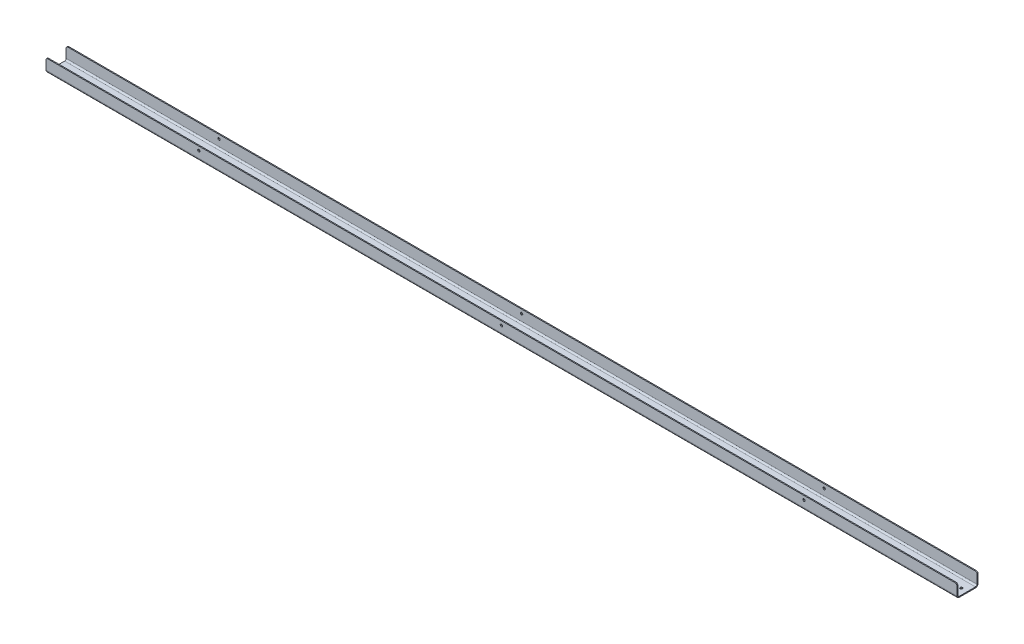
ISO-10303-21;
HEADER;
FILE_DESCRIPTION(('STEP AP214'),'2;1');
FILE_NAME('part.step','',(''),(''),'','','');
FILE_SCHEMA(('AUTOMOTIVE_DESIGN { 1 0 10303 214 1 1 1 1 }'));
ENDSEC;
DATA;
#1=APPLICATION_CONTEXT('core data for automotive mechanical design processes');
#2=APPLICATION_PROTOCOL_DEFINITION('international standard','automotive_design',2000,#1);
#3=PRODUCT_CONTEXT('',#1,'mechanical');
#4=PRODUCT('Part','Part','',(#3));
#5=PRODUCT_RELATED_PRODUCT_CATEGORY('part','',(#4));
#6=PRODUCT_DEFINITION_FORMATION('','',#4);
#7=PRODUCT_DEFINITION_CONTEXT('part definition',#1,'design');
#8=PRODUCT_DEFINITION('design','',#6,#7);
#9=PRODUCT_DEFINITION_SHAPE('','',#8);
#10=(LENGTH_UNIT() NAMED_UNIT(*) SI_UNIT(.MILLI.,.METRE.));
#11=(NAMED_UNIT(*) PLANE_ANGLE_UNIT() SI_UNIT($,.RADIAN.));
#12=(NAMED_UNIT(*) SI_UNIT($,.STERADIAN.) SOLID_ANGLE_UNIT());
#13=UNCERTAINTY_MEASURE_WITH_UNIT(LENGTH_MEASURE(1.E-05),#10,'distance_accuracy_value','');
#14=(GEOMETRIC_REPRESENTATION_CONTEXT(3) GLOBAL_UNCERTAINTY_ASSIGNED_CONTEXT((#13)) GLOBAL_UNIT_ASSIGNED_CONTEXT((#10,
#11,#12)) REPRESENTATION_CONTEXT('',''));
#15=CARTESIAN_POINT('',(0.,0.,0.));
#16=DIRECTION('',(0.,0.,1.));
#17=DIRECTION('',(1.,0.,0.));
#18=AXIS2_PLACEMENT_3D('',#15,#16,#17);
#19=CARTESIAN_POINT('',(1911.35,5.207,0.));
#20=DIRECTION('',(1.,0.,0.));
#21=DIRECTION('',(0.,0.,-1.));
#22=AXIS2_PLACEMENT_3D('',#19,#20,#21);
#23=PLANE('',#22);
#24=DIRECTION('',(0.,0.,-1.));
#25=VECTOR('',#24,1.);
#26=CARTESIAN_POINT('',(1911.35,5.207,0.));
#27=LINE('',#26,#25);
#28=CARTESIAN_POINT('',(1911.35,5.207,0.));
#29=VERTEX_POINT('',#28);
#30=CARTESIAN_POINT('',(1911.35,5.207,-2.032));
#31=VERTEX_POINT('',#30);
#32=EDGE_CURVE('E270',#29,#31,#27,.T.);
#33=ORIENTED_EDGE('',*,*,#32,.F.);
#34=CARTESIAN_POINT('',(1911.35,5.207,-5.207));
#35=DIRECTION('',(-1.,0.,0.));
#36=DIRECTION('',(0.,0.,1.));
#37=AXIS2_PLACEMENT_3D('',#34,#35,#36);
#38=CIRCLE('',#37,5.207);
#39=CARTESIAN_POINT('',(1911.35,0.,-5.207));
#40=VERTEX_POINT('',#39);
#41=EDGE_CURVE('E197',#29,#40,#38,.F.);
#42=ORIENTED_EDGE('',*,*,#41,.T.);
#43=DIRECTION('',(0.,-1.,0.));
#44=VECTOR('',#43,1.);
#45=CARTESIAN_POINT('',(1911.35,2.032,-5.207));
#46=LINE('',#45,#44);
#47=CARTESIAN_POINT('',(1911.35,2.032,-5.207));
#48=VERTEX_POINT('',#47);
#49=EDGE_CURVE('E268',#48,#40,#46,.T.);
#50=ORIENTED_EDGE('',*,*,#49,.F.);
#51=CARTESIAN_POINT('',(1911.35,5.207,-5.207));
#52=DIRECTION('',(1.,0.,0.));
#53=DIRECTION('',(0.,0.,-1.));
#54=AXIS2_PLACEMENT_3D('',#51,#52,#53);
#55=CIRCLE('',#54,3.175);
#56=EDGE_CURVE('E187',#31,#48,#55,.T.);
#57=ORIENTED_EDGE('',*,*,#56,.F.);
#58=EDGE_LOOP('',(#33,#42,#50,#57));
#59=FACE_BOUND('',#58,.T.);
#60=ADVANCED_FACE('F38',(#59),#23,.T.);
#61=CARTESIAN_POINT('',(1911.35,2.032,-5.207));
#62=DIRECTION('',(1.,0.,0.));
#63=DIRECTION('',(0.,0.,-1.));
#64=AXIS2_PLACEMENT_3D('',#61,#62,#63);
#65=PLANE('',#64);
#66=DIRECTION('',(0.,-1.,0.));
#67=VECTOR('',#66,1.);
#68=CARTESIAN_POINT('',(1911.35,27.432,-2.032));
#69=LINE('',#68,#67);
#70=CARTESIAN_POINT('',(1911.35,24.257,-2.032));
#71=VERTEX_POINT('',#70);
#72=EDGE_CURVE('E193',#71,#31,#69,.T.);
#73=ORIENTED_EDGE('',*,*,#72,.F.);
#74=DIRECTION('',(0.,0.,-1.));
#75=VECTOR('',#74,1.);
#76=CARTESIAN_POINT('',(1911.35,24.257,-5.207));
#77=LINE('',#76,#75);
#78=CARTESIAN_POINT('',(1911.35,24.257,0.));
#79=VERTEX_POINT('',#78);
#80=EDGE_CURVE('E282',#71,#79,#77,.F.);
#81=ORIENTED_EDGE('',*,*,#80,.T.);
#82=DIRECTION('',(0.,-1.,0.));
#83=VECTOR('',#82,1.);
#84=CARTESIAN_POINT('',(1911.35,27.432,0.));
#85=LINE('',#84,#83);
#86=EDGE_CURVE('E195',#79,#29,#85,.T.);
#87=ORIENTED_EDGE('',*,*,#86,.T.);
#88=ORIENTED_EDGE('',*,*,#32,.T.);
#89=EDGE_LOOP('',(#73,#81,#87,#88));
#90=FACE_BOUND('',#89,.T.);
#91=ADVANCED_FACE('F341',(#90),#65,.T.);
#92=CARTESIAN_POINT('',(0.,0.,-5.207));
#93=DIRECTION('',(-1.,0.,0.));
#94=DIRECTION('',(0.,0.,1.));
#95=AXIS2_PLACEMENT_3D('',#92,#93,#94);
#96=PLANE('',#95);
#97=DIRECTION('',(0.,1.,0.));
#98=VECTOR('',#97,1.);
#99=CARTESIAN_POINT('',(0.,0.,-5.207));
#100=LINE('',#99,#98);
#101=CARTESIAN_POINT('',(0.,0.,-5.207));
#102=VERTEX_POINT('',#101);
#103=CARTESIAN_POINT('',(0.,2.032,-5.207));
#104=VERTEX_POINT('',#103);
#105=EDGE_CURVE('E266',#102,#104,#100,.T.);
#106=ORIENTED_EDGE('',*,*,#105,.F.);
#107=CARTESIAN_POINT('',(0.,5.207,-5.207));
#108=DIRECTION('',(-1.,0.,0.));
#109=DIRECTION('',(0.,0.,1.));
#110=AXIS2_PLACEMENT_3D('',#107,#108,#109);
#111=CIRCLE('',#110,5.207);
#112=CARTESIAN_POINT('',(0.,5.207,0.));
#113=VERTEX_POINT('',#112);
#114=EDGE_CURVE('E222',#113,#102,#111,.F.);
#115=ORIENTED_EDGE('',*,*,#114,.F.);
#116=DIRECTION('',(0.,0.,1.));
#117=VECTOR('',#116,1.);
#118=CARTESIAN_POINT('',(0.,5.207,-2.032));
#119=LINE('',#118,#117);
#120=CARTESIAN_POINT('',(0.,5.207,-2.032));
#121=VERTEX_POINT('',#120);
#122=EDGE_CURVE('E263',#121,#113,#119,.T.);
#123=ORIENTED_EDGE('',*,*,#122,.F.);
#124=CARTESIAN_POINT('',(0.,5.207,-5.207));
#125=DIRECTION('',(1.,0.,0.));
#126=DIRECTION('',(0.,0.,-1.));
#127=AXIS2_PLACEMENT_3D('',#124,#125,#126);
#128=CIRCLE('',#127,3.175);
#129=EDGE_CURVE('E215',#121,#104,#128,.T.);
#130=ORIENTED_EDGE('',*,*,#129,.T.);
#131=EDGE_LOOP('',(#106,#115,#123,#130));
#132=FACE_BOUND('',#131,.T.);
#133=ADVANCED_FACE('F321',(#132),#96,.T.);
#134=CARTESIAN_POINT('',(0.,5.207,-2.032));
#135=DIRECTION('',(-1.,0.,0.));
#136=DIRECTION('',(0.,0.,1.));
#137=AXIS2_PLACEMENT_3D('',#134,#135,#136);
#138=PLANE('',#137);
#139=DIRECTION('',(0.,0.,-1.));
#140=VECTOR('',#139,1.);
#141=CARTESIAN_POINT('',(0.,0.,0.));
#142=LINE('',#141,#140);
#143=CARTESIAN_POINT('',(0.,0.,-39.243));
#144=VERTEX_POINT('',#143);
#145=EDGE_CURVE('E225',#102,#144,#142,.T.);
#146=ORIENTED_EDGE('',*,*,#145,.F.);
#147=ORIENTED_EDGE('',*,*,#105,.T.);
#148=DIRECTION('',(0.,0.,-1.));
#149=VECTOR('',#148,1.);
#150=CARTESIAN_POINT('',(0.,2.032,0.));
#151=LINE('',#150,#149);
#152=CARTESIAN_POINT('',(0.,2.032,-39.243));
#153=VERTEX_POINT('',#152);
#154=EDGE_CURVE('E212',#104,#153,#151,.T.);
#155=ORIENTED_EDGE('',*,*,#154,.T.);
#156=DIRECTION('',(0.,-1.,0.));
#157=VECTOR('',#156,1.);
#158=CARTESIAN_POINT('',(0.,2.032,-39.243));
#159=LINE('',#158,#157);
#160=EDGE_CURVE('E259',#153,#144,#159,.T.);
#161=ORIENTED_EDGE('',*,*,#160,.T.);
#162=EDGE_LOOP('',(#146,#147,#155,#161));
#163=FACE_BOUND('',#162,.T.);
#164=ADVANCED_FACE('F368',(#163),#138,.T.);
#165=CARTESIAN_POINT('',(1911.35,0.,-39.243));
#166=DIRECTION('',(1.,0.,0.));
#167=DIRECTION('',(0.,0.,-1.));
#168=AXIS2_PLACEMENT_3D('',#165,#166,#167);
#169=PLANE('',#168);
#170=DIRECTION('',(0.,1.,0.));
#171=VECTOR('',#170,1.);
#172=CARTESIAN_POINT('',(1911.35,0.,-39.243));
#173=LINE('',#172,#171);
#174=CARTESIAN_POINT('',(1911.35,0.,-39.243));
#175=VERTEX_POINT('',#174);
#176=CARTESIAN_POINT('',(1911.35,2.032,-39.243));
#177=VERTEX_POINT('',#176);
#178=EDGE_CURVE('E164',#175,#177,#173,.T.);
#179=ORIENTED_EDGE('',*,*,#178,.F.);
#180=CARTESIAN_POINT('',(1911.35,5.207,-39.243));
#181=DIRECTION('',(-1.,0.,0.));
#182=DIRECTION('',(0.,0.,1.));
#183=AXIS2_PLACEMENT_3D('',#180,#181,#182);
#184=CIRCLE('',#183,5.207);
#185=CARTESIAN_POINT('',(1911.35,5.207,-44.45));
#186=VERTEX_POINT('',#185);
#187=EDGE_CURVE('E162',#175,#186,#184,.F.);
#188=ORIENTED_EDGE('',*,*,#187,.T.);
#189=DIRECTION('',(0.,0.,-1.));
#190=VECTOR('',#189,1.);
#191=CARTESIAN_POINT('',(1911.35,5.207,-42.418));
#192=LINE('',#191,#190);
#193=CARTESIAN_POINT('',(1911.35,5.207,-42.418));
#194=VERTEX_POINT('',#193);
#195=EDGE_CURVE('E155',#194,#186,#192,.T.);
#196=ORIENTED_EDGE('',*,*,#195,.F.);
#197=CARTESIAN_POINT('',(1911.35,5.207,-39.243));
#198=DIRECTION('',(1.,0.,0.));
#199=DIRECTION('',(0.,0.,-1.));
#200=AXIS2_PLACEMENT_3D('',#197,#198,#199);
#201=CIRCLE('',#200,3.175);
#202=EDGE_CURVE('E159',#177,#194,#201,.T.);
#203=ORIENTED_EDGE('',*,*,#202,.F.);
#204=EDGE_LOOP('',(#179,#188,#196,#203));
#205=FACE_BOUND('',#204,.T.);
#206=ADVANCED_FACE('F157',(#205),#169,.T.);
#207=CARTESIAN_POINT('',(1911.35,5.207,-42.418));
#208=DIRECTION('',(1.,0.,0.));
#209=DIRECTION('',(0.,0.,-1.));
#210=AXIS2_PLACEMENT_3D('',#207,#208,#209);
#211=PLANE('',#210);
#212=DIRECTION('',(0.,0.,-1.));
#213=VECTOR('',#212,1.);
#214=CARTESIAN_POINT('',(1911.35,0.,0.));
#215=LINE('',#214,#213);
#216=EDGE_CURVE('E200',#40,#175,#215,.T.);
#217=ORIENTED_EDGE('',*,*,#216,.T.);
#218=ORIENTED_EDGE('',*,*,#178,.T.);
#219=DIRECTION('',(0.,0.,-1.));
#220=VECTOR('',#219,1.);
#221=CARTESIAN_POINT('',(1911.35,2.032,0.));
#222=LINE('',#221,#220);
#223=EDGE_CURVE('E185',#48,#177,#222,.T.);
#224=ORIENTED_EDGE('',*,*,#223,.F.);
#225=ORIENTED_EDGE('',*,*,#49,.T.);
#226=EDGE_LOOP('',(#217,#218,#224,#225));
#227=FACE_BOUND('',#226,.T.);
#228=ADVANCED_FACE('F374',(#227),#211,.T.);
#229=CARTESIAN_POINT('',(0.,5.207,-44.45));
#230=DIRECTION('',(-1.,0.,0.));
#231=DIRECTION('',(0.,0.,1.));
#232=AXIS2_PLACEMENT_3D('',#229,#230,#231);
#233=PLANE('',#232);
#234=DIRECTION('',(0.,0.,1.));
#235=VECTOR('',#234,1.);
#236=CARTESIAN_POINT('',(0.,5.207,-44.45));
#237=LINE('',#236,#235);
#238=CARTESIAN_POINT('',(0.,5.207,-44.45));
#239=VERTEX_POINT('',#238);
#240=CARTESIAN_POINT('',(0.,5.207,-42.418));
#241=VERTEX_POINT('',#240);
#242=EDGE_CURVE('E165',#239,#241,#237,.T.);
#243=ORIENTED_EDGE('',*,*,#242,.F.);
#244=CARTESIAN_POINT('',(0.,5.207,-39.243));
#245=DIRECTION('',(-1.,0.,0.));
#246=DIRECTION('',(0.,0.,1.));
#247=AXIS2_PLACEMENT_3D('',#244,#245,#246);
#248=CIRCLE('',#247,5.207);
#249=EDGE_CURVE('E228',#144,#239,#248,.F.);
#250=ORIENTED_EDGE('',*,*,#249,.F.);
#251=ORIENTED_EDGE('',*,*,#160,.F.);
#252=CARTESIAN_POINT('',(0.,5.207,-39.243));
#253=DIRECTION('',(1.,0.,0.));
#254=DIRECTION('',(0.,0.,-1.));
#255=AXIS2_PLACEMENT_3D('',#252,#253,#254);
#256=CIRCLE('',#255,3.175);
#257=EDGE_CURVE('E210',#153,#241,#256,.T.);
#258=ORIENTED_EDGE('',*,*,#257,.T.);
#259=EDGE_LOOP('',(#243,#250,#251,#258));
#260=FACE_BOUND('',#259,.T.);
#261=ADVANCED_FACE('F377',(#260),#233,.T.);
#262=CARTESIAN_POINT('',(0.,2.032,-39.243));
#263=DIRECTION('',(-1.,0.,0.));
#264=DIRECTION('',(0.,0.,1.));
#265=AXIS2_PLACEMENT_3D('',#262,#263,#264);
#266=PLANE('',#265);
#267=DIRECTION('',(0.,1.,0.));
#268=VECTOR('',#267,1.);
#269=CARTESIAN_POINT('',(0.,0.,-42.418));
#270=LINE('',#269,#268);
#271=CARTESIAN_POINT('',(0.,24.257,-42.418));
#272=VERTEX_POINT('',#271);
#273=EDGE_CURVE('E172',#241,#272,#270,.T.);
#274=ORIENTED_EDGE('',*,*,#273,.T.);
#275=DIRECTION('',(0.,0.,-1.));
#276=VECTOR('',#275,1.);
#277=CARTESIAN_POINT('',(0.,24.257,-39.243));
#278=LINE('',#277,#276);
#279=CARTESIAN_POINT('',(0.,24.257,-44.45));
#280=VERTEX_POINT('',#279);
#281=EDGE_CURVE('E11',#272,#280,#278,.T.);
#282=ORIENTED_EDGE('',*,*,#281,.T.);
#283=DIRECTION('',(0.,1.,0.));
#284=VECTOR('',#283,1.);
#285=CARTESIAN_POINT('',(0.,0.,-44.45));
#286=LINE('',#285,#284);
#287=EDGE_CURVE('E205',#239,#280,#286,.T.);
#288=ORIENTED_EDGE('',*,*,#287,.F.);
#289=ORIENTED_EDGE('',*,*,#242,.T.);
#290=EDGE_LOOP('',(#274,#282,#288,#289));
#291=FACE_BOUND('',#290,.T.);
#292=ADVANCED_FACE('F381',(#291),#266,.T.);
#293=CARTESIAN_POINT('',(1911.35,0.,-44.45));
#294=DIRECTION('',(0.,0.,1.));
#295=DIRECTION('',(1.,0.,0.));
#296=AXIS2_PLACEMENT_3D('',#293,#294,#295);
#297=PLANE('',#296);
#298=CARTESIAN_POINT('',(1590.675,19.05,-44.45));
#299=DIRECTION('',(0.,0.,-1.));
#300=DIRECTION('',(-1.,0.,0.));
#301=AXIS2_PLACEMENT_3D('',#298,#299,#300);
#302=CIRCLE('',#301,2.45110000000003);
#303=CARTESIAN_POINT('',(1588.2239,19.05,-44.45));
#304=VERTEX_POINT('',#303);
#305=EDGE_CURVE('E481',#304,#304,#302,.T.);
#306=ORIENTED_EDGE('',*,*,#305,.F.);
#307=EDGE_LOOP('',(#306));
#308=FACE_BOUND('',#307,.T.);
#309=CARTESIAN_POINT('',(955.675,19.05,-44.45));
#310=DIRECTION('',(0.,0.,-1.));
#311=DIRECTION('',(-1.,0.,0.));
#312=AXIS2_PLACEMENT_3D('',#309,#310,#311);
#313=CIRCLE('',#312,2.45110000000003);
#314=CARTESIAN_POINT('',(953.2239,19.05,-44.45));
#315=VERTEX_POINT('',#314);
#316=EDGE_CURVE('E492',#315,#315,#313,.T.);
#317=ORIENTED_EDGE('',*,*,#316,.F.);
#318=EDGE_LOOP('',(#317));
#319=FACE_BOUND('',#318,.T.);
#320=CARTESIAN_POINT('',(320.675,19.05,-44.45));
#321=DIRECTION('',(0.,0.,-1.));
#322=DIRECTION('',(-1.,0.,0.));
#323=AXIS2_PLACEMENT_3D('',#320,#321,#322);
#324=CIRCLE('',#323,2.45109999999997);
#325=CARTESIAN_POINT('',(318.2239,19.05,-44.45));
#326=VERTEX_POINT('',#325);
#327=EDGE_CURVE('E498',#326,#326,#324,.T.);
#328=ORIENTED_EDGE('',*,*,#327,.F.);
#329=EDGE_LOOP('',(#328));
#330=FACE_BOUND('',#329,.T.);
#331=DIRECTION('',(-1.,0.,0.));
#332=VECTOR('',#331,1.);
#333=CARTESIAN_POINT('',(1911.35,27.432,-44.45));
#334=LINE('',#333,#332);
#335=CARTESIAN_POINT('',(1908.175,27.432,-44.45));
#336=VERTEX_POINT('',#335);
#337=CARTESIAN_POINT('',(3.17499999999993,27.432,-44.45));
#338=VERTEX_POINT('',#337);
#339=EDGE_CURVE('E256',#336,#338,#334,.T.);
#340=ORIENTED_EDGE('',*,*,#339,.F.);
#341=CARTESIAN_POINT('',(1908.175,24.257,-44.45));
#342=DIRECTION('',(0.,0.,1.));
#343=DIRECTION('',(1.,0.,0.));
#344=AXIS2_PLACEMENT_3D('',#341,#342,#343);
#345=CIRCLE('',#344,3.175);
#346=CARTESIAN_POINT('',(1911.35,24.257,-44.45));
#347=VERTEX_POINT('',#346);
#348=EDGE_CURVE('E295',#336,#347,#345,.F.);
#349=ORIENTED_EDGE('',*,*,#348,.T.);
#350=DIRECTION('',(0.,1.,0.));
#351=VECTOR('',#350,1.);
#352=CARTESIAN_POINT('',(1911.35,0.,-44.45));
#353=LINE('',#352,#351);
#354=EDGE_CURVE('E180',#186,#347,#353,.T.);
#355=ORIENTED_EDGE('',*,*,#354,.F.);
#356=DIRECTION('',(-1.,0.,0.));
#357=VECTOR('',#356,1.);
#358=CARTESIAN_POINT('',(1911.35,5.207,-44.45));
#359=LINE('',#358,#357);
#360=EDGE_CURVE('E204',#186,#239,#359,.T.);
#361=ORIENTED_EDGE('',*,*,#360,.T.);
#362=ORIENTED_EDGE('',*,*,#287,.T.);
#363=CARTESIAN_POINT('',(3.175,24.257,-44.45));
#364=DIRECTION('',(0.,0.,1.));
#365=DIRECTION('',(1.,0.,0.));
#366=AXIS2_PLACEMENT_3D('',#363,#364,#365);
#367=CIRCLE('',#366,3.175);
#368=EDGE_CURVE('E293',#280,#338,#367,.F.);
#369=ORIENTED_EDGE('',*,*,#368,.T.);
#370=EDGE_LOOP('',(#340,#349,#355,#361,#362,#369));
#371=FACE_BOUND('',#370,.T.);
#372=ADVANCED_FACE('F385',(#308,#319,#330,#371),#297,.F.);
#373=CARTESIAN_POINT('',(1911.35,27.432,-42.418));
#374=DIRECTION('',(0.,1.,0.));
#375=DIRECTION('',(0.,0.,1.));
#376=AXIS2_PLACEMENT_3D('',#373,#374,#375);
#377=PLANE('',#376);
#378=DIRECTION('',(-1.,0.,0.));
#379=VECTOR('',#378,1.);
#380=CARTESIAN_POINT('',(1911.35,27.432,-42.418));
#381=LINE('',#380,#379);
#382=CARTESIAN_POINT('',(1908.175,27.432,-42.418));
#383=VERTEX_POINT('',#382);
#384=CARTESIAN_POINT('',(3.17499999999993,27.432,-42.418));
#385=VERTEX_POINT('',#384);
#386=EDGE_CURVE('E176',#383,#385,#381,.T.);
#387=ORIENTED_EDGE('',*,*,#386,.F.);
#388=DIRECTION('',(0.,0.,-1.));
#389=VECTOR('',#388,1.);
#390=CARTESIAN_POINT('',(1908.175,27.432,-42.418));
#391=LINE('',#390,#389);
#392=EDGE_CURVE('E290',#383,#336,#391,.T.);
#393=ORIENTED_EDGE('',*,*,#392,.T.);
#394=ORIENTED_EDGE('',*,*,#339,.T.);
#395=DIRECTION('',(0.,0.,-1.));
#396=VECTOR('',#395,1.);
#397=CARTESIAN_POINT('',(3.17499999999993,27.432,-42.418));
#398=LINE('',#397,#396);
#399=EDGE_CURVE('E288',#338,#385,#398,.F.);
#400=ORIENTED_EDGE('',*,*,#399,.T.);
#401=EDGE_LOOP('',(#387,#393,#394,#400));
#402=FACE_BOUND('',#401,.T.);
#403=ADVANCED_FACE('F389',(#402),#377,.T.);
#404=CARTESIAN_POINT('',(1911.35,0.,-42.418));
#405=DIRECTION('',(0.,0.,1.));
#406=DIRECTION('',(1.,0.,0.));
#407=AXIS2_PLACEMENT_3D('',#404,#405,#406);
#408=PLANE('',#407);
#409=CARTESIAN_POINT('',(1590.675,19.05,-42.418));
#410=DIRECTION('',(0.,0.,1.));
#411=DIRECTION('',(1.,0.,0.));
#412=AXIS2_PLACEMENT_3D('',#409,#410,#411);
#413=CIRCLE('',#412,2.45110000000003);
#414=CARTESIAN_POINT('',(1593.1261,19.05,-42.418));
#415=VERTEX_POINT('',#414);
#416=EDGE_CURVE('E510',#415,#415,#413,.T.);
#417=ORIENTED_EDGE('',*,*,#416,.F.);
#418=EDGE_LOOP('',(#417));
#419=FACE_BOUND('',#418,.T.);
#420=CARTESIAN_POINT('',(955.675,19.05,-42.418));
#421=DIRECTION('',(0.,0.,1.));
#422=DIRECTION('',(1.,0.,0.));
#423=AXIS2_PLACEMENT_3D('',#420,#421,#422);
#424=CIRCLE('',#423,2.45110000000003);
#425=CARTESIAN_POINT('',(958.1261,19.05,-42.418));
#426=VERTEX_POINT('',#425);
#427=EDGE_CURVE('E506',#426,#426,#424,.T.);
#428=ORIENTED_EDGE('',*,*,#427,.F.);
#429=EDGE_LOOP('',(#428));
#430=FACE_BOUND('',#429,.T.);
#431=CARTESIAN_POINT('',(320.675,19.05,-42.418));
#432=DIRECTION('',(0.,0.,1.));
#433=DIRECTION('',(1.,0.,0.));
#434=AXIS2_PLACEMENT_3D('',#431,#432,#433);
#435=CIRCLE('',#434,2.45109999999997);
#436=CARTESIAN_POINT('',(323.1261,19.05,-42.418));
#437=VERTEX_POINT('',#436);
#438=EDGE_CURVE('E484',#437,#437,#435,.T.);
#439=ORIENTED_EDGE('',*,*,#438,.F.);
#440=EDGE_LOOP('',(#439));
#441=FACE_BOUND('',#440,.T.);
#442=DIRECTION('',(0.,1.,0.));
#443=VECTOR('',#442,1.);
#444=CARTESIAN_POINT('',(1911.35,0.,-42.418));
#445=LINE('',#444,#443);
#446=CARTESIAN_POINT('',(1911.35,24.257,-42.418));
#447=VERTEX_POINT('',#446);
#448=EDGE_CURVE('E170',#194,#447,#445,.T.);
#449=ORIENTED_EDGE('',*,*,#448,.T.);
#450=CARTESIAN_POINT('',(1908.175,24.257,-42.418));
#451=DIRECTION('',(0.,0.,1.));
#452=DIRECTION('',(1.,0.,0.));
#453=AXIS2_PLACEMENT_3D('',#450,#451,#452);
#454=CIRCLE('',#453,3.175);
#455=EDGE_CURVE('E299',#447,#383,#454,.T.);
#456=ORIENTED_EDGE('',*,*,#455,.T.);
#457=ORIENTED_EDGE('',*,*,#386,.T.);
#458=CARTESIAN_POINT('',(3.175,24.257,-42.418));
#459=DIRECTION('',(0.,0.,1.));
#460=DIRECTION('',(1.,0.,0.));
#461=AXIS2_PLACEMENT_3D('',#458,#459,#460);
#462=CIRCLE('',#461,3.175);
#463=EDGE_CURVE('E53',#385,#272,#462,.T.);
#464=ORIENTED_EDGE('',*,*,#463,.T.);
#465=ORIENTED_EDGE('',*,*,#273,.F.);
#466=DIRECTION('',(-1.,0.,0.));
#467=VECTOR('',#466,1.);
#468=CARTESIAN_POINT('',(1911.35,5.207,-42.418));
#469=LINE('',#468,#467);
#470=EDGE_CURVE('E168',#194,#241,#469,.T.);
#471=ORIENTED_EDGE('',*,*,#470,.F.);
#472=EDGE_LOOP('',(#449,#456,#457,#464,#465,#471));
#473=FACE_BOUND('',#472,.T.);
#474=ADVANCED_FACE('F169',(#419,#430,#441,#473),#408,.T.);
#475=CARTESIAN_POINT('',(1911.35,5.207,-39.243));
#476=DIRECTION('',(-1.,0.,0.));
#477=DIRECTION('',(0.,0.,1.));
#478=AXIS2_PLACEMENT_3D('',#475,#476,#477);
#479=CYLINDRICAL_SURFACE('',#478,3.175);
#480=ORIENTED_EDGE('',*,*,#257,.F.);
#481=DIRECTION('',(-1.,0.,0.));
#482=VECTOR('',#481,1.);
#483=CARTESIAN_POINT('',(1911.35,2.032,-39.243));
#484=LINE('',#483,#482);
#485=EDGE_CURVE('E177',#177,#153,#484,.T.);
#486=ORIENTED_EDGE('',*,*,#485,.F.);
#487=ORIENTED_EDGE('',*,*,#202,.T.);
#488=ORIENTED_EDGE('',*,*,#470,.T.);
#489=EDGE_LOOP('',(#480,#486,#487,#488));
#490=FACE_BOUND('',#489,.T.);
#491=ADVANCED_FACE('F183',(#490),#479,.F.);
#492=CARTESIAN_POINT('',(1911.35,2.032,0.));
#493=DIRECTION('',(0.,1.,0.));
#494=DIRECTION('',(0.,0.,1.));
#495=AXIS2_PLACEMENT_3D('',#492,#493,#494);
#496=PLANE('',#495);
#497=CARTESIAN_POINT('',(12.7,2.032,-22.225));
#498=DIRECTION('',(0.,1.,0.));
#499=DIRECTION('',(0.,0.,1.));
#500=AXIS2_PLACEMENT_3D('',#497,#498,#499);
#501=CIRCLE('',#500,2.4511);
#502=CARTESIAN_POINT('',(12.7,2.032,-19.7739));
#503=VERTEX_POINT('',#502);
#504=EDGE_CURVE('E208',#503,#503,#501,.T.);
#505=ORIENTED_EDGE('',*,*,#504,.F.);
#506=EDGE_LOOP('',(#505));
#507=FACE_BOUND('',#506,.T.);
#508=CARTESIAN_POINT('',(1241.425,2.032,-22.225));
#509=DIRECTION('',(0.,1.,0.));
#510=DIRECTION('',(0.,0.,1.));
#511=AXIS2_PLACEMENT_3D('',#508,#509,#510);
#512=CIRCLE('',#511,2.45110000000003);
#513=CARTESIAN_POINT('',(1241.425,2.032,-19.7739));
#514=VERTEX_POINT('',#513);
#515=EDGE_CURVE('E555',#514,#514,#512,.T.);
#516=ORIENTED_EDGE('',*,*,#515,.F.);
#517=EDGE_LOOP('',(#516));
#518=FACE_BOUND('',#517,.T.);
#519=CARTESIAN_POINT('',(1260.475,2.032,-22.225));
#520=DIRECTION('',(0.,1.,0.));
#521=DIRECTION('',(0.,0.,1.));
#522=AXIS2_PLACEMENT_3D('',#519,#520,#521);
#523=CIRCLE('',#522,2.45110000000003);
#524=CARTESIAN_POINT('',(1260.475,2.032,-19.7739));
#525=VERTEX_POINT('',#524);
#526=EDGE_CURVE('E552',#525,#525,#523,.T.);
#527=ORIENTED_EDGE('',*,*,#526,.F.);
#528=EDGE_LOOP('',(#527));
#529=FACE_BOUND('',#528,.T.);
#530=CARTESIAN_POINT('',(1879.6,2.032,-22.225));
#531=DIRECTION('',(0.,1.,0.));
#532=DIRECTION('',(0.,0.,1.));
#533=AXIS2_PLACEMENT_3D('',#530,#531,#532);
#534=CIRCLE('',#533,2.45110000000003);
#535=CARTESIAN_POINT('',(1879.6,2.032,-19.7739));
#536=VERTEX_POINT('',#535);
#537=EDGE_CURVE('E549',#536,#536,#534,.T.);
#538=ORIENTED_EDGE('',*,*,#537,.F.);
#539=EDGE_LOOP('',(#538));
#540=FACE_BOUND('',#539,.T.);
#541=CARTESIAN_POINT('',(1898.65,2.032,-22.225));
#542=DIRECTION('',(0.,1.,0.));
#543=DIRECTION('',(0.,0.,1.));
#544=AXIS2_PLACEMENT_3D('',#541,#542,#543);
#545=CIRCLE('',#544,2.45110000000003);
#546=CARTESIAN_POINT('',(1898.65,2.032,-19.7739));
#547=VERTEX_POINT('',#546);
#548=EDGE_CURVE('E546',#547,#547,#545,.T.);
#549=ORIENTED_EDGE('',*,*,#548,.F.);
#550=EDGE_LOOP('',(#549));
#551=FACE_BOUND('',#550,.T.);
#552=CARTESIAN_POINT('',(669.925,2.032,-22.225));
#553=DIRECTION('',(0.,1.,0.));
#554=DIRECTION('',(0.,0.,1.));
#555=AXIS2_PLACEMENT_3D('',#552,#553,#554);
#556=CIRCLE('',#555,2.45110000000003);
#557=CARTESIAN_POINT('',(669.925,2.032,-19.7739));
#558=VERTEX_POINT('',#557);
#559=EDGE_CURVE('E543',#558,#558,#556,.T.);
#560=ORIENTED_EDGE('',*,*,#559,.F.);
#561=EDGE_LOOP('',(#560));
#562=FACE_BOUND('',#561,.T.);
#563=CARTESIAN_POINT('',(650.875,2.032,-22.225));
#564=DIRECTION('',(0.,1.,0.));
#565=DIRECTION('',(0.,0.,1.));
#566=AXIS2_PLACEMENT_3D('',#563,#564,#565);
#567=CIRCLE('',#566,2.45110000000003);
#568=CARTESIAN_POINT('',(650.875,2.032,-19.7739));
#569=VERTEX_POINT('',#568);
#570=EDGE_CURVE('E540',#569,#569,#567,.T.);
#571=ORIENTED_EDGE('',*,*,#570,.F.);
#572=EDGE_LOOP('',(#571));
#573=FACE_BOUND('',#572,.T.);
#574=CARTESIAN_POINT('',(31.75,2.032,-22.225));
#575=DIRECTION('',(0.,1.,0.));
#576=DIRECTION('',(0.,0.,1.));
#577=AXIS2_PLACEMENT_3D('',#574,#575,#576);
#578=CIRCLE('',#577,2.4511);
#579=CARTESIAN_POINT('',(31.75,2.032,-19.7739));
#580=VERTEX_POINT('',#579);
#581=EDGE_CURVE('E517',#580,#580,#578,.T.);
#582=ORIENTED_EDGE('',*,*,#581,.F.);
#583=EDGE_LOOP('',(#582));
#584=FACE_BOUND('',#583,.T.);
#585=ORIENTED_EDGE('',*,*,#154,.F.);
#586=DIRECTION('',(-1.,0.,0.));
#587=VECTOR('',#586,1.);
#588=CARTESIAN_POINT('',(1911.35,2.032,-5.207));
#589=LINE('',#588,#587);
#590=EDGE_CURVE('E251',#48,#104,#589,.T.);
#591=ORIENTED_EDGE('',*,*,#590,.F.);
#592=ORIENTED_EDGE('',*,*,#223,.T.);
#593=ORIENTED_EDGE('',*,*,#485,.T.);
#594=EDGE_LOOP('',(#585,#591,#592,#593));
#595=FACE_BOUND('',#594,.T.);
#596=ADVANCED_FACE('F399',(#507,#518,#529,#540,#551,#562,#573,#584,#595),#496,.T.);
#597=CARTESIAN_POINT('',(1911.35,5.207,-5.207));
#598=DIRECTION('',(-1.,0.,0.));
#599=DIRECTION('',(0.,0.,1.));
#600=AXIS2_PLACEMENT_3D('',#597,#598,#599);
#601=CYLINDRICAL_SURFACE('',#600,3.175);
#602=ORIENTED_EDGE('',*,*,#129,.F.);
#603=DIRECTION('',(-1.,0.,0.));
#604=VECTOR('',#603,1.);
#605=CARTESIAN_POINT('',(1911.35,5.207,-2.032));
#606=LINE('',#605,#604);
#607=EDGE_CURVE('E248',#31,#121,#606,.T.);
#608=ORIENTED_EDGE('',*,*,#607,.F.);
#609=ORIENTED_EDGE('',*,*,#56,.T.);
#610=ORIENTED_EDGE('',*,*,#590,.T.);
#611=EDGE_LOOP('',(#602,#608,#609,#610));
#612=FACE_BOUND('',#611,.T.);
#613=ADVANCED_FACE('F317',(#612),#601,.F.);
#614=CARTESIAN_POINT('',(1911.35,27.432,-2.032));
#615=DIRECTION('',(0.,0.,-1.));
#616=DIRECTION('',(0.,1.,0.));
#617=AXIS2_PLACEMENT_3D('',#614,#615,#616);
#618=PLANE('',#617);
#619=CARTESIAN_POINT('',(1590.675,19.05,-2.032));
#620=DIRECTION('',(0.,0.,-1.));
#621=DIRECTION('',(0.,1.,0.));
#622=AXIS2_PLACEMENT_3D('',#619,#620,#621);
#623=CIRCLE('',#622,2.45110000000003);
#624=CARTESIAN_POINT('',(1590.675,21.5011,-2.032));
#625=VERTEX_POINT('',#624);
#626=EDGE_CURVE('E476',#625,#625,#623,.T.);
#627=ORIENTED_EDGE('',*,*,#626,.F.);
#628=EDGE_LOOP('',(#627));
#629=FACE_BOUND('',#628,.T.);
#630=CARTESIAN_POINT('',(955.675,19.05,-2.032));
#631=DIRECTION('',(0.,0.,-1.));
#632=DIRECTION('',(0.,1.,0.));
#633=AXIS2_PLACEMENT_3D('',#630,#631,#632);
#634=CIRCLE('',#633,2.45110000000003);
#635=CARTESIAN_POINT('',(955.675,21.5011,-2.032));
#636=VERTEX_POINT('',#635);
#637=EDGE_CURVE('E503',#636,#636,#634,.T.);
#638=ORIENTED_EDGE('',*,*,#637,.F.);
#639=EDGE_LOOP('',(#638));
#640=FACE_BOUND('',#639,.T.);
#641=CARTESIAN_POINT('',(320.675,19.05,-2.032));
#642=DIRECTION('',(0.,0.,-1.));
#643=DIRECTION('',(0.,1.,0.));
#644=AXIS2_PLACEMENT_3D('',#641,#642,#643);
#645=CIRCLE('',#644,2.45109999999997);
#646=CARTESIAN_POINT('',(320.675,21.5011,-2.032));
#647=VERTEX_POINT('',#646);
#648=EDGE_CURVE('E480',#647,#647,#645,.T.);
#649=ORIENTED_EDGE('',*,*,#648,.F.);
#650=EDGE_LOOP('',(#649));
#651=FACE_BOUND('',#650,.T.);
#652=DIRECTION('',(-1.,0.,0.));
#653=VECTOR('',#652,1.);
#654=CARTESIAN_POINT('',(1911.35,27.432,-2.032));
#655=LINE('',#654,#653);
#656=CARTESIAN_POINT('',(1908.175,27.432,-2.032));
#657=VERTEX_POINT('',#656);
#658=CARTESIAN_POINT('',(3.17499999999993,27.432,-2.032));
#659=VERTEX_POINT('',#658);
#660=EDGE_CURVE('E245',#657,#659,#655,.T.);
#661=ORIENTED_EDGE('',*,*,#660,.F.);
#662=CARTESIAN_POINT('',(1908.175,24.257,-2.032));
#663=DIRECTION('',(0.,0.,-1.));
#664=DIRECTION('',(0.,1.,0.));
#665=AXIS2_PLACEMENT_3D('',#662,#663,#664);
#666=CIRCLE('',#665,3.175);
#667=EDGE_CURVE('E280',#657,#71,#666,.T.);
#668=ORIENTED_EDGE('',*,*,#667,.T.);
#669=ORIENTED_EDGE('',*,*,#72,.T.);
#670=ORIENTED_EDGE('',*,*,#607,.T.);
#671=DIRECTION('',(0.,-1.,0.));
#672=VECTOR('',#671,1.);
#673=CARTESIAN_POINT('',(0.,27.432,-2.032));
#674=LINE('',#673,#672);
#675=CARTESIAN_POINT('',(0.,24.257,-2.032));
#676=VERTEX_POINT('',#675);
#677=EDGE_CURVE('E218',#676,#121,#674,.T.);
#678=ORIENTED_EDGE('',*,*,#677,.F.);
#679=CARTESIAN_POINT('',(3.175,24.257,-2.032));
#680=DIRECTION('',(0.,0.,-1.));
#681=DIRECTION('',(0.,1.,0.));
#682=AXIS2_PLACEMENT_3D('',#679,#680,#681);
#683=CIRCLE('',#682,3.175);
#684=EDGE_CURVE('E278',#676,#659,#683,.T.);
#685=ORIENTED_EDGE('',*,*,#684,.T.);
#686=EDGE_LOOP('',(#661,#668,#669,#670,#678,#685));
#687=FACE_BOUND('',#686,.T.);
#688=ADVANCED_FACE('F311',(#629,#640,#651,#687),#618,.T.);
#689=CARTESIAN_POINT('',(1911.35,27.432,0.));
#690=DIRECTION('',(0.,1.,0.));
#691=DIRECTION('',(0.,0.,1.));
#692=AXIS2_PLACEMENT_3D('',#689,#690,#691);
#693=PLANE('',#692);
#694=DIRECTION('',(-1.,0.,0.));
#695=VECTOR('',#694,1.);
#696=CARTESIAN_POINT('',(1911.35,27.432,0.));
#697=LINE('',#696,#695);
#698=CARTESIAN_POINT('',(1908.175,27.432,0.));
#699=VERTEX_POINT('',#698);
#700=CARTESIAN_POINT('',(3.17499999999993,27.432,0.));
#701=VERTEX_POINT('',#700);
#702=EDGE_CURVE('E242',#699,#701,#697,.T.);
#703=ORIENTED_EDGE('',*,*,#702,.F.);
#704=DIRECTION('',(0.,0.,-1.));
#705=VECTOR('',#704,1.);
#706=CARTESIAN_POINT('',(1908.175,27.432,0.));
#707=LINE('',#706,#705);
#708=EDGE_CURVE('E275',#699,#657,#707,.T.);
#709=ORIENTED_EDGE('',*,*,#708,.T.);
#710=ORIENTED_EDGE('',*,*,#660,.T.);
#711=DIRECTION('',(0.,0.,-1.));
#712=VECTOR('',#711,1.);
#713=CARTESIAN_POINT('',(3.175,27.432,0.));
#714=LINE('',#713,#712);
#715=EDGE_CURVE('E273',#659,#701,#714,.F.);
#716=ORIENTED_EDGE('',*,*,#715,.T.);
#717=EDGE_LOOP('',(#703,#709,#710,#716));
#718=FACE_BOUND('',#717,.T.);
#719=ADVANCED_FACE('F336',(#718),#693,.T.);
#720=CARTESIAN_POINT('',(1911.35,27.432,0.));
#721=DIRECTION('',(0.,0.,-1.));
#722=DIRECTION('',(0.,1.,0.));
#723=AXIS2_PLACEMENT_3D('',#720,#721,#722);
#724=PLANE('',#723);
#725=CARTESIAN_POINT('',(1590.675,19.05,0.));
#726=DIRECTION('',(0.,0.,-1.));
#727=DIRECTION('',(-1.,0.,0.));
#728=AXIS2_PLACEMENT_3D('',#725,#726,#727);
#729=CIRCLE('',#728,2.45110000000003);
#730=CARTESIAN_POINT('',(1588.2239,19.05,0.));
#731=VERTEX_POINT('',#730);
#732=EDGE_CURVE('E479',#731,#731,#729,.T.);
#733=ORIENTED_EDGE('',*,*,#732,.T.);
#734=EDGE_LOOP('',(#733));
#735=FACE_BOUND('',#734,.T.);
#736=CARTESIAN_POINT('',(955.675,19.05,0.));
#737=DIRECTION('',(0.,0.,-1.));
#738=DIRECTION('',(-1.,0.,0.));
#739=AXIS2_PLACEMENT_3D('',#736,#737,#738);
#740=CIRCLE('',#739,2.45110000000003);
#741=CARTESIAN_POINT('',(953.2239,19.05,0.));
#742=VERTEX_POINT('',#741);
#743=EDGE_CURVE('E487',#742,#742,#740,.T.);
#744=ORIENTED_EDGE('',*,*,#743,.T.);
#745=EDGE_LOOP('',(#744));
#746=FACE_BOUND('',#745,.T.);
#747=CARTESIAN_POINT('',(320.675,19.05,0.));
#748=DIRECTION('',(0.,0.,-1.));
#749=DIRECTION('',(-1.,0.,0.));
#750=AXIS2_PLACEMENT_3D('',#747,#748,#749);
#751=CIRCLE('',#750,2.45109999999997);
#752=CARTESIAN_POINT('',(318.2239,19.05,0.));
#753=VERTEX_POINT('',#752);
#754=EDGE_CURVE('E495',#753,#753,#751,.T.);
#755=ORIENTED_EDGE('',*,*,#754,.T.);
#756=EDGE_LOOP('',(#755));
#757=FACE_BOUND('',#756,.T.);
#758=ORIENTED_EDGE('',*,*,#86,.F.);
#759=CARTESIAN_POINT('',(1908.175,24.257,0.));
#760=DIRECTION('',(0.,0.,-1.));
#761=DIRECTION('',(0.,1.,0.));
#762=AXIS2_PLACEMENT_3D('',#759,#760,#761);
#763=CIRCLE('',#762,3.175);
#764=EDGE_CURVE('E286',#79,#699,#763,.F.);
#765=ORIENTED_EDGE('',*,*,#764,.T.);
#766=ORIENTED_EDGE('',*,*,#702,.T.);
#767=CARTESIAN_POINT('',(3.175,24.257,0.));
#768=DIRECTION('',(0.,0.,-1.));
#769=DIRECTION('',(0.,1.,0.));
#770=AXIS2_PLACEMENT_3D('',#767,#768,#769);
#771=CIRCLE('',#770,3.175);
#772=CARTESIAN_POINT('',(0.,24.257,0.));
#773=VERTEX_POINT('',#772);
#774=EDGE_CURVE('E284',#701,#773,#771,.F.);
#775=ORIENTED_EDGE('',*,*,#774,.T.);
#776=DIRECTION('',(0.,-1.,0.));
#777=VECTOR('',#776,1.);
#778=CARTESIAN_POINT('',(0.,27.432,0.));
#779=LINE('',#778,#777);
#780=EDGE_CURVE('E220',#773,#113,#779,.T.);
#781=ORIENTED_EDGE('',*,*,#780,.T.);
#782=DIRECTION('',(-1.,0.,0.));
#783=VECTOR('',#782,1.);
#784=CARTESIAN_POINT('',(1911.35,5.207,0.));
#785=LINE('',#784,#783);
#786=EDGE_CURVE('E239',#29,#113,#785,.T.);
#787=ORIENTED_EDGE('',*,*,#786,.F.);
#788=EDGE_LOOP('',(#758,#765,#766,#775,#781,#787));
#789=FACE_BOUND('',#788,.T.);
#790=ADVANCED_FACE('F330',(#735,#746,#757,#789),#724,.F.);
#791=CARTESIAN_POINT('',(1911.35,5.207,-5.207));
#792=DIRECTION('',(-1.,0.,0.));
#793=DIRECTION('',(0.,0.,1.));
#794=AXIS2_PLACEMENT_3D('',#791,#792,#793);
#795=CYLINDRICAL_SURFACE('',#794,5.207);
#796=ORIENTED_EDGE('',*,*,#114,.T.);
#797=DIRECTION('',(-1.,0.,0.));
#798=VECTOR('',#797,1.);
#799=CARTESIAN_POINT('',(1911.35,0.,-5.207));
#800=LINE('',#799,#798);
#801=EDGE_CURVE('E236',#40,#102,#800,.T.);
#802=ORIENTED_EDGE('',*,*,#801,.F.);
#803=ORIENTED_EDGE('',*,*,#41,.F.);
#804=ORIENTED_EDGE('',*,*,#786,.T.);
#805=EDGE_LOOP('',(#796,#802,#803,#804));
#806=FACE_BOUND('',#805,.T.);
#807=ADVANCED_FACE('F326',(#806),#795,.T.);
#808=CARTESIAN_POINT('',(1911.35,0.,0.));
#809=DIRECTION('',(0.,1.,0.));
#810=DIRECTION('',(0.,0.,1.));
#811=AXIS2_PLACEMENT_3D('',#808,#809,#810);
#812=PLANE('',#811);
#813=CARTESIAN_POINT('',(12.7,0.,-22.225));
#814=DIRECTION('',(0.,-1.,0.));
#815=DIRECTION('',(0.,0.,-1.));
#816=AXIS2_PLACEMENT_3D('',#813,#814,#815);
#817=CIRCLE('',#816,2.4511);
#818=CARTESIAN_POINT('',(12.7,0.,-24.6761));
#819=VERTEX_POINT('',#818);
#820=EDGE_CURVE('E514',#819,#819,#817,.T.);
#821=ORIENTED_EDGE('',*,*,#820,.F.);
#822=EDGE_LOOP('',(#821));
#823=FACE_BOUND('',#822,.T.);
#824=CARTESIAN_POINT('',(1241.425,0.,-22.225));
#825=DIRECTION('',(0.,-1.,0.));
#826=DIRECTION('',(0.,0.,1.));
#827=AXIS2_PLACEMENT_3D('',#824,#825,#826);
#828=CIRCLE('',#827,2.45110000000003);
#829=CARTESIAN_POINT('',(1241.425,0.,-19.7739));
#830=VERTEX_POINT('',#829);
#831=EDGE_CURVE('E513',#830,#830,#828,.T.);
#832=ORIENTED_EDGE('',*,*,#831,.F.);
#833=EDGE_LOOP('',(#832));
#834=FACE_BOUND('',#833,.T.);
#835=CARTESIAN_POINT('',(1260.475,0.,-22.225));
#836=DIRECTION('',(0.,-1.,0.));
#837=DIRECTION('',(0.,0.,1.));
#838=AXIS2_PLACEMENT_3D('',#835,#836,#837);
#839=CIRCLE('',#838,2.45110000000003);
#840=CARTESIAN_POINT('',(1260.475,0.,-19.7739));
#841=VERTEX_POINT('',#840);
#842=EDGE_CURVE('E523',#841,#841,#839,.T.);
#843=ORIENTED_EDGE('',*,*,#842,.F.);
#844=EDGE_LOOP('',(#843));
#845=FACE_BOUND('',#844,.T.);
#846=CARTESIAN_POINT('',(1879.6,0.,-22.225));
#847=DIRECTION('',(0.,-1.,0.));
#848=DIRECTION('',(0.,0.,1.));
#849=AXIS2_PLACEMENT_3D('',#846,#847,#848);
#850=CIRCLE('',#849,2.45110000000003);
#851=CARTESIAN_POINT('',(1879.6,0.,-19.7739));
#852=VERTEX_POINT('',#851);
#853=EDGE_CURVE('E519',#852,#852,#850,.T.);
#854=ORIENTED_EDGE('',*,*,#853,.F.);
#855=EDGE_LOOP('',(#854));
#856=FACE_BOUND('',#855,.T.);
#857=CARTESIAN_POINT('',(1898.65,0.,-22.225));
#858=DIRECTION('',(0.,-1.,0.));
#859=DIRECTION('',(0.,0.,1.));
#860=AXIS2_PLACEMENT_3D('',#857,#858,#859);
#861=CIRCLE('',#860,2.45110000000003);
#862=CARTESIAN_POINT('',(1898.65,0.,-19.7739));
#863=VERTEX_POINT('',#862);
#864=EDGE_CURVE('E522',#863,#863,#861,.T.);
#865=ORIENTED_EDGE('',*,*,#864,.F.);
#866=EDGE_LOOP('',(#865));
#867=FACE_BOUND('',#866,.T.);
#868=CARTESIAN_POINT('',(669.925,0.,-22.225));
#869=DIRECTION('',(0.,-1.,0.));
#870=DIRECTION('',(0.,0.,-1.));
#871=AXIS2_PLACEMENT_3D('',#868,#869,#870);
#872=CIRCLE('',#871,2.45110000000003);
#873=CARTESIAN_POINT('',(669.925,0.,-24.6761));
#874=VERTEX_POINT('',#873);
#875=EDGE_CURVE('E533',#874,#874,#872,.T.);
#876=ORIENTED_EDGE('',*,*,#875,.F.);
#877=EDGE_LOOP('',(#876));
#878=FACE_BOUND('',#877,.T.);
#879=CARTESIAN_POINT('',(650.875,0.,-22.225));
#880=DIRECTION('',(0.,-1.,0.));
#881=DIRECTION('',(0.,0.,-1.));
#882=AXIS2_PLACEMENT_3D('',#879,#880,#881);
#883=CIRCLE('',#882,2.45110000000003);
#884=CARTESIAN_POINT('',(650.875,0.,-24.6761));
#885=VERTEX_POINT('',#884);
#886=EDGE_CURVE('E530',#885,#885,#883,.T.);
#887=ORIENTED_EDGE('',*,*,#886,.F.);
#888=EDGE_LOOP('',(#887));
#889=FACE_BOUND('',#888,.T.);
#890=CARTESIAN_POINT('',(31.75,0.,-22.225));
#891=DIRECTION('',(0.,-1.,0.));
#892=DIRECTION('',(0.,0.,-1.));
#893=AXIS2_PLACEMENT_3D('',#890,#891,#892);
#894=CIRCLE('',#893,2.4511);
#895=CARTESIAN_POINT('',(31.75,0.,-24.6761));
#896=VERTEX_POINT('',#895);
#897=EDGE_CURVE('E518',#896,#896,#894,.T.);
#898=ORIENTED_EDGE('',*,*,#897,.F.);
#899=EDGE_LOOP('',(#898));
#900=FACE_BOUND('',#899,.T.);
#901=ORIENTED_EDGE('',*,*,#145,.T.);
#902=DIRECTION('',(-1.,0.,0.));
#903=VECTOR('',#902,1.);
#904=CARTESIAN_POINT('',(1911.35,0.,-39.243));
#905=LINE('',#904,#903);
#906=EDGE_CURVE('E233',#175,#144,#905,.T.);
#907=ORIENTED_EDGE('',*,*,#906,.F.);
#908=ORIENTED_EDGE('',*,*,#216,.F.);
#909=ORIENTED_EDGE('',*,*,#801,.T.);
#910=EDGE_LOOP('',(#901,#907,#908,#909));
#911=FACE_BOUND('',#910,.T.);
#912=ADVANCED_FACE('F415',(#823,#834,#845,#856,#867,#878,#889,#900,#911),#812,.F.);
#913=CARTESIAN_POINT('',(1911.35,5.207,-39.243));
#914=DIRECTION('',(-1.,0.,0.));
#915=DIRECTION('',(0.,0.,1.));
#916=AXIS2_PLACEMENT_3D('',#913,#914,#915);
#917=CYLINDRICAL_SURFACE('',#916,5.207);
#918=ORIENTED_EDGE('',*,*,#249,.T.);
#919=ORIENTED_EDGE('',*,*,#360,.F.);
#920=ORIENTED_EDGE('',*,*,#187,.F.);
#921=ORIENTED_EDGE('',*,*,#906,.T.);
#922=EDGE_LOOP('',(#918,#919,#920,#921));
#923=FACE_BOUND('',#922,.T.);
#924=ADVANCED_FACE('F418',(#923),#917,.T.);
#925=CARTESIAN_POINT('',(1911.35,5.207,-39.243));
#926=DIRECTION('',(1.,0.,0.));
#927=DIRECTION('',(0.,0.,-1.));
#928=AXIS2_PLACEMENT_3D('',#925,#926,#927);
#929=PLANE('',#928);
#930=ORIENTED_EDGE('',*,*,#354,.T.);
#931=DIRECTION('',(0.,0.,-1.));
#932=VECTOR('',#931,1.);
#933=CARTESIAN_POINT('',(1911.35,24.257,-39.243));
#934=LINE('',#933,#932);
#935=EDGE_CURVE('E61',#347,#447,#934,.F.);
#936=ORIENTED_EDGE('',*,*,#935,.T.);
#937=ORIENTED_EDGE('',*,*,#448,.F.);
#938=ORIENTED_EDGE('',*,*,#195,.T.);
#939=EDGE_LOOP('',(#930,#936,#937,#938));
#940=FACE_BOUND('',#939,.T.);
#941=ADVANCED_FACE('F179',(#940),#929,.T.);
#942=CARTESIAN_POINT('',(0.,5.207,-39.243));
#943=DIRECTION('',(1.,0.,0.));
#944=DIRECTION('',(0.,0.,-1.));
#945=AXIS2_PLACEMENT_3D('',#942,#943,#944);
#946=PLANE('',#945);
#947=ORIENTED_EDGE('',*,*,#780,.F.);
#948=DIRECTION('',(0.,0.,-1.));
#949=VECTOR('',#948,1.);
#950=CARTESIAN_POINT('',(0.,24.257,-2.032));
#951=LINE('',#950,#949);
#952=EDGE_CURVE('E46',#773,#676,#951,.T.);
#953=ORIENTED_EDGE('',*,*,#952,.T.);
#954=ORIENTED_EDGE('',*,*,#677,.T.);
#955=ORIENTED_EDGE('',*,*,#122,.T.);
#956=EDGE_LOOP('',(#947,#953,#954,#955));
#957=FACE_BOUND('',#956,.T.);
#958=ADVANCED_FACE('F305',(#957),#946,.F.);
#959=CARTESIAN_POINT('',(31.75,27.432,-22.225));
#960=DIRECTION('',(0.,-1.,0.));
#961=DIRECTION('',(0.,0.,-1.));
#962=AXIS2_PLACEMENT_3D('',#959,#960,#961);
#963=CYLINDRICAL_SURFACE('',#962,2.4511);
#964=ORIENTED_EDGE('',*,*,#581,.T.);
#965=EDGE_LOOP('',(#964));
#966=FACE_BOUND('',#965,.T.);
#967=ORIENTED_EDGE('',*,*,#897,.T.);
#968=EDGE_LOOP('',(#967));
#969=FACE_BOUND('',#968,.T.);
#970=ADVANCED_FACE('F425',(#966,#969),#963,.F.);
#971=CARTESIAN_POINT('',(650.875,27.432,-22.225));
#972=DIRECTION('',(0.,-1.,0.));
#973=DIRECTION('',(0.,0.,-1.));
#974=AXIS2_PLACEMENT_3D('',#971,#972,#973);
#975=CYLINDRICAL_SURFACE('',#974,2.45110000000003);
#976=ORIENTED_EDGE('',*,*,#570,.T.);
#977=EDGE_LOOP('',(#976));
#978=FACE_BOUND('',#977,.T.);
#979=ORIENTED_EDGE('',*,*,#886,.T.);
#980=EDGE_LOOP('',(#979));
#981=FACE_BOUND('',#980,.T.);
#982=ADVANCED_FACE('F436',(#978,#981),#975,.F.);
#983=CARTESIAN_POINT('',(669.925,27.432,-22.225));
#984=DIRECTION('',(0.,-1.,0.));
#985=DIRECTION('',(0.,0.,-1.));
#986=AXIS2_PLACEMENT_3D('',#983,#984,#985);
#987=CYLINDRICAL_SURFACE('',#986,2.45110000000003);
#988=ORIENTED_EDGE('',*,*,#559,.T.);
#989=EDGE_LOOP('',(#988));
#990=FACE_BOUND('',#989,.T.);
#991=ORIENTED_EDGE('',*,*,#875,.T.);
#992=EDGE_LOOP('',(#991));
#993=FACE_BOUND('',#992,.T.);
#994=ADVANCED_FACE('F432',(#990,#993),#987,.F.);
#995=CARTESIAN_POINT('',(1898.65,27.432,-22.225));
#996=DIRECTION('',(0.,-1.,0.));
#997=DIRECTION('',(0.,0.,-1.));
#998=AXIS2_PLACEMENT_3D('',#995,#996,#997);
#999=CYLINDRICAL_SURFACE('',#998,2.45110000000003);
#1000=ORIENTED_EDGE('',*,*,#548,.T.);
#1001=EDGE_LOOP('',(#1000));
#1002=FACE_BOUND('',#1001,.T.);
#1003=ORIENTED_EDGE('',*,*,#864,.T.);
#1004=EDGE_LOOP('',(#1003));
#1005=FACE_BOUND('',#1004,.T.);
#1006=ADVANCED_FACE('F428',(#1002,#1005),#999,.F.);
#1007=CARTESIAN_POINT('',(1879.6,27.432,-22.225));
#1008=DIRECTION('',(0.,-1.,0.));
#1009=DIRECTION('',(0.,0.,-1.));
#1010=AXIS2_PLACEMENT_3D('',#1007,#1008,#1009);
#1011=CYLINDRICAL_SURFACE('',#1010,2.45110000000003);
#1012=ORIENTED_EDGE('',*,*,#537,.T.);
#1013=EDGE_LOOP('',(#1012));
#1014=FACE_BOUND('',#1013,.T.);
#1015=ORIENTED_EDGE('',*,*,#853,.T.);
#1016=EDGE_LOOP('',(#1015));
#1017=FACE_BOUND('',#1016,.T.);
#1018=ADVANCED_FACE('F431',(#1014,#1017),#1011,.F.);
#1019=CARTESIAN_POINT('',(1260.475,27.432,-22.225));
#1020=DIRECTION('',(0.,-1.,0.));
#1021=DIRECTION('',(0.,0.,-1.));
#1022=AXIS2_PLACEMENT_3D('',#1019,#1020,#1021);
#1023=CYLINDRICAL_SURFACE('',#1022,2.45110000000003);
#1024=ORIENTED_EDGE('',*,*,#526,.T.);
#1025=EDGE_LOOP('',(#1024));
#1026=FACE_BOUND('',#1025,.T.);
#1027=ORIENTED_EDGE('',*,*,#842,.T.);
#1028=EDGE_LOOP('',(#1027));
#1029=FACE_BOUND('',#1028,.T.);
#1030=ADVANCED_FACE('F448',(#1026,#1029),#1023,.F.);
#1031=CARTESIAN_POINT('',(1241.425,27.432,-22.225));
#1032=DIRECTION('',(0.,-1.,0.));
#1033=DIRECTION('',(0.,0.,-1.));
#1034=AXIS2_PLACEMENT_3D('',#1031,#1032,#1033);
#1035=CYLINDRICAL_SURFACE('',#1034,2.45110000000003);
#1036=ORIENTED_EDGE('',*,*,#515,.T.);
#1037=EDGE_LOOP('',(#1036));
#1038=FACE_BOUND('',#1037,.T.);
#1039=ORIENTED_EDGE('',*,*,#831,.T.);
#1040=EDGE_LOOP('',(#1039));
#1041=FACE_BOUND('',#1040,.T.);
#1042=ADVANCED_FACE('F444',(#1038,#1041),#1035,.F.);
#1043=CARTESIAN_POINT('',(12.7,27.432,-22.225));
#1044=DIRECTION('',(0.,-1.,0.));
#1045=DIRECTION('',(0.,0.,-1.));
#1046=AXIS2_PLACEMENT_3D('',#1043,#1044,#1045);
#1047=CYLINDRICAL_SURFACE('',#1046,2.4511);
#1048=ORIENTED_EDGE('',*,*,#504,.T.);
#1049=EDGE_LOOP('',(#1048));
#1050=FACE_BOUND('',#1049,.T.);
#1051=ORIENTED_EDGE('',*,*,#820,.T.);
#1052=EDGE_LOOP('',(#1051));
#1053=FACE_BOUND('',#1052,.T.);
#1054=ADVANCED_FACE('F447',(#1050,#1053),#1047,.F.);
#1055=CARTESIAN_POINT('',(320.675,19.05,0.));
#1056=DIRECTION('',(0.,0.,-1.));
#1057=DIRECTION('',(-1.,0.,0.));
#1058=AXIS2_PLACEMENT_3D('',#1055,#1056,#1057);
#1059=CYLINDRICAL_SURFACE('',#1058,2.45109999999997);
#1060=ORIENTED_EDGE('',*,*,#648,.T.);
#1061=EDGE_LOOP('',(#1060));
#1062=FACE_BOUND('',#1061,.T.);
#1063=ORIENTED_EDGE('',*,*,#754,.F.);
#1064=EDGE_LOOP('',(#1063));
#1065=FACE_BOUND('',#1064,.T.);
#1066=ADVANCED_FACE('F458',(#1062,#1065),#1059,.F.);
#1067=CARTESIAN_POINT('',(955.675,19.05,0.));
#1068=DIRECTION('',(0.,0.,-1.));
#1069=DIRECTION('',(-1.,0.,0.));
#1070=AXIS2_PLACEMENT_3D('',#1067,#1068,#1069);
#1071=CYLINDRICAL_SURFACE('',#1070,2.45110000000003);
#1072=ORIENTED_EDGE('',*,*,#637,.T.);
#1073=EDGE_LOOP('',(#1072));
#1074=FACE_BOUND('',#1073,.T.);
#1075=ORIENTED_EDGE('',*,*,#743,.F.);
#1076=EDGE_LOOP('',(#1075));
#1077=FACE_BOUND('',#1076,.T.);
#1078=ADVANCED_FACE('F462',(#1074,#1077),#1071,.F.);
#1079=CARTESIAN_POINT('',(1590.675,19.05,0.));
#1080=DIRECTION('',(0.,0.,-1.));
#1081=DIRECTION('',(-1.,0.,0.));
#1082=AXIS2_PLACEMENT_3D('',#1079,#1080,#1081);
#1083=CYLINDRICAL_SURFACE('',#1082,2.45110000000003);
#1084=ORIENTED_EDGE('',*,*,#626,.T.);
#1085=EDGE_LOOP('',(#1084));
#1086=FACE_BOUND('',#1085,.T.);
#1087=ORIENTED_EDGE('',*,*,#732,.F.);
#1088=EDGE_LOOP('',(#1087));
#1089=FACE_BOUND('',#1088,.T.);
#1090=ADVANCED_FACE('F357',(#1086,#1089),#1083,.F.);
#1091=ORIENTED_EDGE('',*,*,#438,.T.);
#1092=EDGE_LOOP('',(#1091));
#1093=FACE_BOUND('',#1092,.T.);
#1094=ORIENTED_EDGE('',*,*,#327,.T.);
#1095=EDGE_LOOP('',(#1094));
#1096=FACE_BOUND('',#1095,.T.);
#1097=ADVANCED_FACE('F464',(#1093,#1096),#1059,.F.);
#1098=ORIENTED_EDGE('',*,*,#427,.T.);
#1099=EDGE_LOOP('',(#1098));
#1100=FACE_BOUND('',#1099,.T.);
#1101=ORIENTED_EDGE('',*,*,#316,.T.);
#1102=EDGE_LOOP('',(#1101));
#1103=FACE_BOUND('',#1102,.T.);
#1104=ADVANCED_FACE('F354',(#1100,#1103),#1071,.F.);
#1105=ORIENTED_EDGE('',*,*,#416,.T.);
#1106=EDGE_LOOP('',(#1105));
#1107=FACE_BOUND('',#1106,.T.);
#1108=ORIENTED_EDGE('',*,*,#305,.T.);
#1109=EDGE_LOOP('',(#1108));
#1110=FACE_BOUND('',#1109,.T.);
#1111=ADVANCED_FACE('F346',(#1107,#1110),#1083,.F.);
#1112=CARTESIAN_POINT('',(1908.175,24.257,0.));
#1113=DIRECTION('',(0.,0.,-1.));
#1114=DIRECTION('',(-1.,0.,0.));
#1115=AXIS2_PLACEMENT_3D('',#1112,#1113,#1114);
#1116=CYLINDRICAL_SURFACE('',#1115,3.175);
#1117=ORIENTED_EDGE('',*,*,#764,.F.);
#1118=ORIENTED_EDGE('',*,*,#80,.F.);
#1119=ORIENTED_EDGE('',*,*,#667,.F.);
#1120=ORIENTED_EDGE('',*,*,#708,.F.);
#1121=EDGE_LOOP('',(#1117,#1118,#1119,#1120));
#1122=FACE_BOUND('',#1121,.T.);
#1123=ADVANCED_FACE('F343',(#1122),#1116,.T.);
#1124=CARTESIAN_POINT('',(1908.175,24.257,-42.418));
#1125=DIRECTION('',(0.,0.,-1.));
#1126=DIRECTION('',(-1.,0.,0.));
#1127=AXIS2_PLACEMENT_3D('',#1124,#1125,#1126);
#1128=CYLINDRICAL_SURFACE('',#1127,3.175);
#1129=ORIENTED_EDGE('',*,*,#455,.F.);
#1130=ORIENTED_EDGE('',*,*,#935,.F.);
#1131=ORIENTED_EDGE('',*,*,#348,.F.);
#1132=ORIENTED_EDGE('',*,*,#392,.F.);
#1133=EDGE_LOOP('',(#1129,#1130,#1131,#1132));
#1134=FACE_BOUND('',#1133,.T.);
#1135=ADVANCED_FACE('F345',(#1134),#1128,.T.);
#1136=CARTESIAN_POINT('',(3.175,24.257,-39.243));
#1137=DIRECTION('',(0.,0.,1.));
#1138=DIRECTION('',(1.,0.,0.));
#1139=AXIS2_PLACEMENT_3D('',#1136,#1137,#1138);
#1140=CYLINDRICAL_SURFACE('',#1139,3.175);
#1141=ORIENTED_EDGE('',*,*,#774,.F.);
#1142=ORIENTED_EDGE('',*,*,#715,.F.);
#1143=ORIENTED_EDGE('',*,*,#684,.F.);
#1144=ORIENTED_EDGE('',*,*,#952,.F.);
#1145=EDGE_LOOP('',(#1141,#1142,#1143,#1144));
#1146=FACE_BOUND('',#1145,.T.);
#1147=ADVANCED_FACE('F334',(#1146),#1140,.T.);
#1148=CARTESIAN_POINT('',(3.175,24.257,-39.243));
#1149=DIRECTION('',(0.,0.,-1.));
#1150=DIRECTION('',(-1.,0.,0.));
#1151=AXIS2_PLACEMENT_3D('',#1148,#1149,#1150);
#1152=CYLINDRICAL_SURFACE('',#1151,3.175);
#1153=ORIENTED_EDGE('',*,*,#463,.F.);
#1154=ORIENTED_EDGE('',*,*,#399,.F.);
#1155=ORIENTED_EDGE('',*,*,#368,.F.);
#1156=ORIENTED_EDGE('',*,*,#281,.F.);
#1157=EDGE_LOOP('',(#1153,#1154,#1155,#1156));
#1158=FACE_BOUND('',#1157,.T.);
#1159=ADVANCED_FACE('F40',(#1158),#1152,.T.);
#1160=CLOSED_SHELL('',(#60,#91,#133,#164,#206,#228,#261,#292,#372,#403,#474,#491,#596,#613,#688,
#719,#790,#807,#912,#924,#941,#958,#970,#982,#994,#1006,#1018,#1030,#1042,#1054,#1066,#1078,
#1090,#1097,#1104,#1111,#1123,#1135,#1147,#1159));
#1161=MANIFOLD_SOLID_BREP('B2',#1160);
#1162=ADVANCED_BREP_SHAPE_REPRESENTATION('',(#18,#1161),#14);
#1163=SHAPE_DEFINITION_REPRESENTATION(#9,#1162);
ENDSEC;
END-ISO-10303-21;
